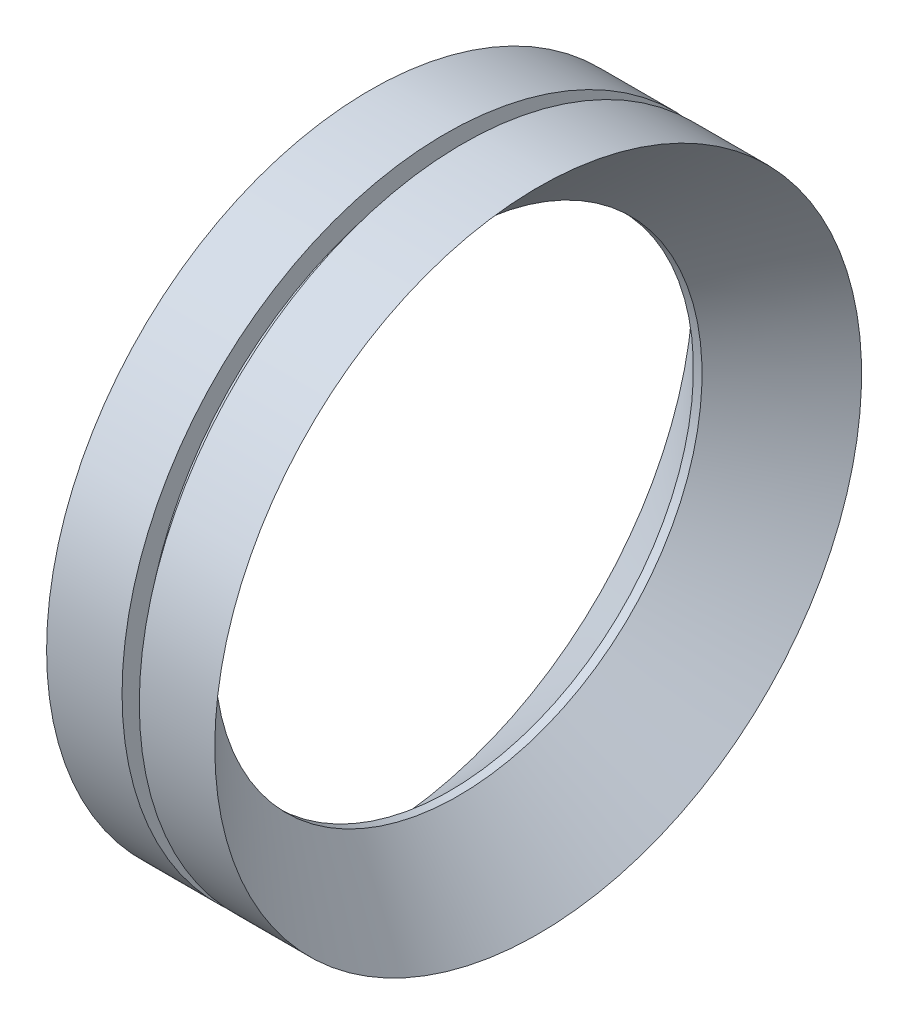
ISO-10303-21;
HEADER;
FILE_DESCRIPTION(('STEP AP214'),'2;1');
FILE_NAME('part.step','',(''),(''),'','','');
FILE_SCHEMA(('AUTOMOTIVE_DESIGN { 1 0 10303 214 1 1 1 1 }'));
ENDSEC;
DATA;
#1=APPLICATION_CONTEXT('core data for automotive mechanical design processes');
#2=APPLICATION_PROTOCOL_DEFINITION('international standard','automotive_design',2000,#1);
#3=PRODUCT_CONTEXT('',#1,'mechanical');
#4=PRODUCT('Part','Part','',(#3));
#5=PRODUCT_RELATED_PRODUCT_CATEGORY('part','',(#4));
#6=PRODUCT_DEFINITION_FORMATION('','',#4);
#7=PRODUCT_DEFINITION_CONTEXT('part definition',#1,'design');
#8=PRODUCT_DEFINITION('design','',#6,#7);
#9=PRODUCT_DEFINITION_SHAPE('','',#8);
#10=(LENGTH_UNIT() NAMED_UNIT(*) SI_UNIT(.MILLI.,.METRE.));
#11=(NAMED_UNIT(*) PLANE_ANGLE_UNIT() SI_UNIT($,.RADIAN.));
#12=(NAMED_UNIT(*) SI_UNIT($,.STERADIAN.) SOLID_ANGLE_UNIT());
#13=UNCERTAINTY_MEASURE_WITH_UNIT(LENGTH_MEASURE(1.E-05),#10,'distance_accuracy_value','');
#14=(GEOMETRIC_REPRESENTATION_CONTEXT(3) GLOBAL_UNCERTAINTY_ASSIGNED_CONTEXT((#13)) GLOBAL_UNIT_ASSIGNED_CONTEXT((#10,
#11,#12)) REPRESENTATION_CONTEXT('',''));
#15=CARTESIAN_POINT('',(0.,0.,0.));
#16=DIRECTION('',(0.,0.,1.));
#17=DIRECTION('',(1.,0.,0.));
#18=AXIS2_PLACEMENT_3D('',#15,#16,#17);
#19=CARTESIAN_POINT('',(-6.00000000000001,0.,0.));
#20=DIRECTION('',(-1.,0.,0.));
#21=DIRECTION('',(0.,0.,1.));
#22=AXIS2_PLACEMENT_3D('',#19,#20,#21);
#23=CONICAL_SURFACE('',#22,113.,0.78539816339745);
#24=CARTESIAN_POINT('',(-43.,0.,0.));
#25=DIRECTION('',(-1.,0.,0.));
#26=DIRECTION('',(0.,0.,1.));
#27=AXIS2_PLACEMENT_3D('',#24,#25,#26);
#28=CIRCLE('',#27,150.);
#29=CARTESIAN_POINT('',(-43.,0.,150.));
#30=VERTEX_POINT('',#29);
#31=EDGE_CURVE('E58',#30,#30,#28,.T.);
#32=ORIENTED_EDGE('',*,*,#31,.T.);
#33=EDGE_LOOP('',(#32));
#34=FACE_BOUND('',#33,.T.);
#35=CARTESIAN_POINT('',(-6.00000000000001,0.,0.));
#36=DIRECTION('',(-1.,0.,0.));
#37=DIRECTION('',(0.,0.,1.));
#38=AXIS2_PLACEMENT_3D('',#35,#36,#37);
#39=CIRCLE('',#38,113.);
#40=CARTESIAN_POINT('',(-6.00000000000001,0.,113.));
#41=VERTEX_POINT('',#40);
#42=EDGE_CURVE('E10',#41,#41,#39,.T.);
#43=ORIENTED_EDGE('',*,*,#42,.F.);
#44=EDGE_LOOP('',(#43));
#45=FACE_BOUND('',#44,.T.);
#46=ADVANCED_FACE('F30',(#34,#45),#23,.F.);
#47=CARTESIAN_POINT('',(-128.467741935484,0.,0.));
#48=DIRECTION('',(-1.,0.,0.));
#49=DIRECTION('',(0.,0.,1.));
#50=AXIS2_PLACEMENT_3D('',#47,#48,#49);
#51=CYLINDRICAL_SURFACE('',#50,113.);
#52=ORIENTED_EDGE('',*,*,#42,.T.);
#53=EDGE_LOOP('',(#52));
#54=FACE_BOUND('',#53,.T.);
#55=CARTESIAN_POINT('',(-2.,0.,0.));
#56=DIRECTION('',(-1.,0.,0.));
#57=DIRECTION('',(0.,0.,1.));
#58=AXIS2_PLACEMENT_3D('',#55,#56,#57);
#59=CIRCLE('',#58,113.);
#60=CARTESIAN_POINT('',(-2.,0.,113.));
#61=VERTEX_POINT('',#60);
#62=EDGE_CURVE('E36',#61,#61,#59,.T.);
#63=ORIENTED_EDGE('',*,*,#62,.F.);
#64=EDGE_LOOP('',(#63));
#65=FACE_BOUND('',#64,.T.);
#66=ADVANCED_FACE('F76',(#54,#65),#51,.F.);
#67=CARTESIAN_POINT('',(35.,0.,0.));
#68=DIRECTION('',(1.,0.,0.));
#69=DIRECTION('',(0.,0.,-1.));
#70=AXIS2_PLACEMENT_3D('',#67,#68,#69);
#71=CONICAL_SURFACE('',#70,150.,0.78539816339745);
#72=ORIENTED_EDGE('',*,*,#62,.T.);
#73=EDGE_LOOP('',(#72));
#74=FACE_BOUND('',#73,.T.);
#75=CARTESIAN_POINT('',(35.,0.,0.));
#76=DIRECTION('',(-1.,0.,0.));
#77=DIRECTION('',(0.,0.,1.));
#78=AXIS2_PLACEMENT_3D('',#75,#76,#77);
#79=CIRCLE('',#78,150.);
#80=CARTESIAN_POINT('',(35.,0.,150.));
#81=VERTEX_POINT('',#80);
#82=EDGE_CURVE('E40',#81,#81,#79,.T.);
#83=ORIENTED_EDGE('',*,*,#82,.F.);
#84=EDGE_LOOP('',(#83));
#85=FACE_BOUND('',#84,.T.);
#86=ADVANCED_FACE('F80',(#74,#85),#71,.F.);
#87=CARTESIAN_POINT('',(-128.467741935484,0.,0.));
#88=DIRECTION('',(-1.,0.,0.));
#89=DIRECTION('',(0.,0.,1.));
#90=AXIS2_PLACEMENT_3D('',#87,#88,#89);
#91=CYLINDRICAL_SURFACE('',#90,150.);
#92=ORIENTED_EDGE('',*,*,#82,.T.);
#93=EDGE_LOOP('',(#92));
#94=FACE_BOUND('',#93,.T.);
#95=CARTESIAN_POINT('',(0.,0.,0.));
#96=DIRECTION('',(-1.,0.,0.));
#97=DIRECTION('',(0.,0.,1.));
#98=AXIS2_PLACEMENT_3D('',#95,#96,#97);
#99=CIRCLE('',#98,150.);
#100=CARTESIAN_POINT('',(0.,0.,150.));
#101=VERTEX_POINT('',#100);
#102=EDGE_CURVE('E44',#101,#101,#99,.T.);
#103=ORIENTED_EDGE('',*,*,#102,.F.);
#104=EDGE_LOOP('',(#103));
#105=FACE_BOUND('',#104,.T.);
#106=ADVANCED_FACE('F84',(#94,#105),#91,.T.);
#107=CARTESIAN_POINT('',(0.,-140.,0.));
#108=DIRECTION('',(-1.,0.,0.));
#109=DIRECTION('',(0.,0.,1.));
#110=AXIS2_PLACEMENT_3D('',#107,#108,#109);
#111=PLANE('',#110);
#112=ORIENTED_EDGE('',*,*,#102,.T.);
#113=EDGE_LOOP('',(#112));
#114=FACE_BOUND('',#113,.T.);
#115=CARTESIAN_POINT('',(0.,0.,0.));
#116=DIRECTION('',(-1.,0.,0.));
#117=DIRECTION('',(0.,0.,1.));
#118=AXIS2_PLACEMENT_3D('',#115,#116,#117);
#119=CIRCLE('',#118,140.);
#120=CARTESIAN_POINT('',(0.,0.,140.));
#121=VERTEX_POINT('',#120);
#122=EDGE_CURVE('E49',#121,#121,#119,.T.);
#123=ORIENTED_EDGE('',*,*,#122,.F.);
#124=EDGE_LOOP('',(#123));
#125=FACE_BOUND('',#124,.T.);
#126=ADVANCED_FACE('F90',(#114,#125),#111,.T.);
#127=CARTESIAN_POINT('',(-128.467741935484,0.,0.));
#128=DIRECTION('',(-1.,0.,0.));
#129=DIRECTION('',(0.,0.,1.));
#130=AXIS2_PLACEMENT_3D('',#127,#128,#129);
#131=CYLINDRICAL_SURFACE('',#130,140.);
#132=ORIENTED_EDGE('',*,*,#122,.T.);
#133=EDGE_LOOP('',(#132));
#134=FACE_BOUND('',#133,.T.);
#135=CARTESIAN_POINT('',(-8.00000000000001,0.,0.));
#136=DIRECTION('',(-1.,0.,0.));
#137=DIRECTION('',(0.,0.,1.));
#138=AXIS2_PLACEMENT_3D('',#135,#136,#137);
#139=CIRCLE('',#138,140.);
#140=CARTESIAN_POINT('',(-8.00000000000001,0.,140.));
#141=VERTEX_POINT('',#140);
#142=EDGE_CURVE('E52',#141,#141,#139,.T.);
#143=ORIENTED_EDGE('',*,*,#142,.F.);
#144=EDGE_LOOP('',(#143));
#145=FACE_BOUND('',#144,.T.);
#146=ADVANCED_FACE('F72',(#134,#145),#131,.T.);
#147=CARTESIAN_POINT('',(-8.,-150.,0.));
#148=DIRECTION('',(1.,0.,0.));
#149=DIRECTION('',(0.,0.,-1.));
#150=AXIS2_PLACEMENT_3D('',#147,#148,#149);
#151=PLANE('',#150);
#152=ORIENTED_EDGE('',*,*,#142,.T.);
#153=EDGE_LOOP('',(#152));
#154=FACE_BOUND('',#153,.T.);
#155=CARTESIAN_POINT('',(-8.00000000000001,0.,0.));
#156=DIRECTION('',(-1.,0.,0.));
#157=DIRECTION('',(0.,0.,1.));
#158=AXIS2_PLACEMENT_3D('',#155,#156,#157);
#159=CIRCLE('',#158,150.);
#160=CARTESIAN_POINT('',(-8.00000000000001,0.,150.));
#161=VERTEX_POINT('',#160);
#162=EDGE_CURVE('E55',#161,#161,#159,.T.);
#163=ORIENTED_EDGE('',*,*,#162,.F.);
#164=EDGE_LOOP('',(#163));
#165=FACE_BOUND('',#164,.T.);
#166=ADVANCED_FACE('F66',(#154,#165),#151,.T.);
#167=CARTESIAN_POINT('',(-128.467741935484,0.,0.));
#168=DIRECTION('',(-1.,0.,0.));
#169=DIRECTION('',(0.,0.,1.));
#170=AXIS2_PLACEMENT_3D('',#167,#168,#169);
#171=CYLINDRICAL_SURFACE('',#170,150.);
#172=ORIENTED_EDGE('',*,*,#162,.T.);
#173=EDGE_LOOP('',(#172));
#174=FACE_BOUND('',#173,.T.);
#175=ORIENTED_EDGE('',*,*,#31,.F.);
#176=EDGE_LOOP('',(#175));
#177=FACE_BOUND('',#176,.T.);
#178=ADVANCED_FACE('F64',(#174,#177),#171,.T.);
#179=CLOSED_SHELL('',(#46,#66,#86,#106,#126,#146,#166,#178));
#180=MANIFOLD_SOLID_BREP('B2',#179);
#181=ADVANCED_BREP_SHAPE_REPRESENTATION('',(#18,#180),#14);
#182=SHAPE_DEFINITION_REPRESENTATION(#9,#181);
ENDSEC;
END-ISO-10303-21;
